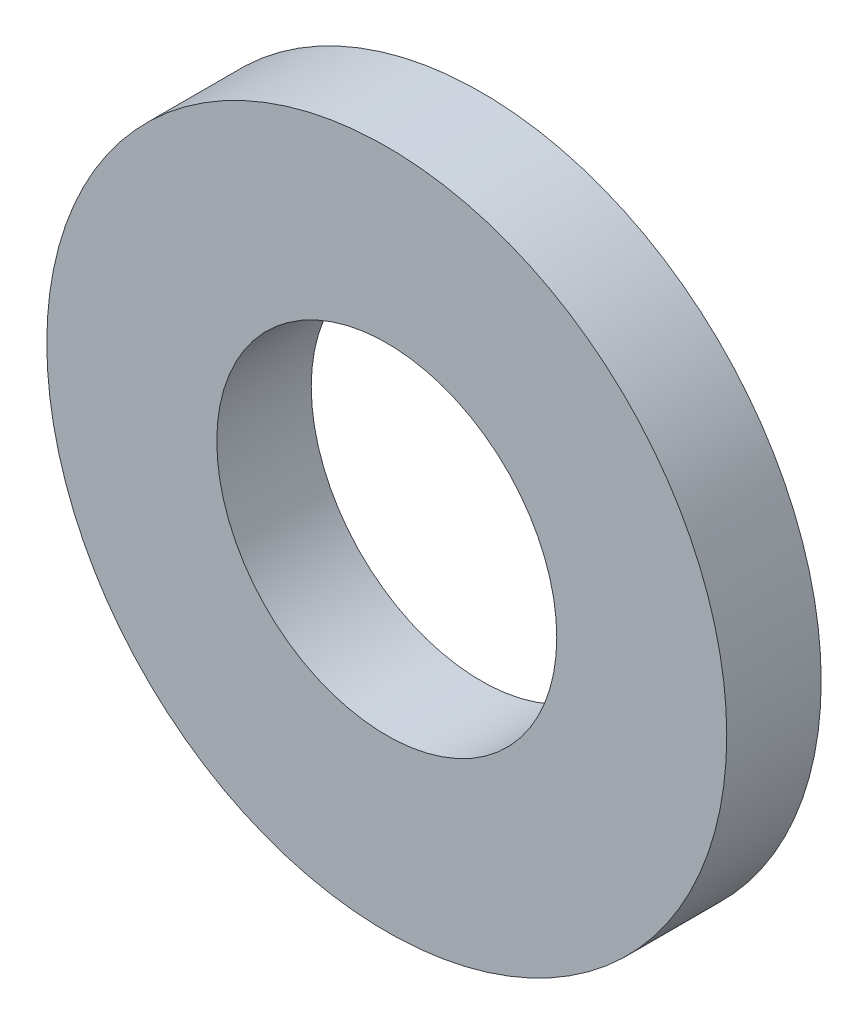
ISO-10303-21;
HEADER;
FILE_DESCRIPTION(('STEP AP214'),'2;1');
FILE_NAME('part.step','',(''),(''),'','','');
FILE_SCHEMA(('AUTOMOTIVE_DESIGN { 1 0 10303 214 1 1 1 1 }'));
ENDSEC;
DATA;
#1=APPLICATION_CONTEXT('core data for automotive mechanical design processes');
#2=APPLICATION_PROTOCOL_DEFINITION('international standard','automotive_design',2000,#1);
#3=PRODUCT_CONTEXT('',#1,'mechanical');
#4=PRODUCT('Part','Part','',(#3));
#5=PRODUCT_RELATED_PRODUCT_CATEGORY('part','',(#4));
#6=PRODUCT_DEFINITION_FORMATION('','',#4);
#7=PRODUCT_DEFINITION_CONTEXT('part definition',#1,'design');
#8=PRODUCT_DEFINITION('design','',#6,#7);
#9=PRODUCT_DEFINITION_SHAPE('','',#8);
#10=(LENGTH_UNIT() NAMED_UNIT(*) SI_UNIT(.MILLI.,.METRE.));
#11=(NAMED_UNIT(*) PLANE_ANGLE_UNIT() SI_UNIT($,.RADIAN.));
#12=(NAMED_UNIT(*) SI_UNIT($,.STERADIAN.) SOLID_ANGLE_UNIT());
#13=UNCERTAINTY_MEASURE_WITH_UNIT(LENGTH_MEASURE(1.E-05),#10,'distance_accuracy_value','');
#14=(GEOMETRIC_REPRESENTATION_CONTEXT(3) GLOBAL_UNCERTAINTY_ASSIGNED_CONTEXT((#13)) GLOBAL_UNIT_ASSIGNED_CONTEXT((#10,
#11,#12)) REPRESENTATION_CONTEXT('',''));
#15=CARTESIAN_POINT('',(0.,0.,0.));
#16=DIRECTION('',(0.,0.,1.));
#17=DIRECTION('',(1.,0.,0.));
#18=AXIS2_PLACEMENT_3D('',#15,#16,#17);
#19=CARTESIAN_POINT('',(0.,0.,1.25));
#20=DIRECTION('',(0.,0.,1.));
#21=DIRECTION('',(1.,0.,0.));
#22=AXIS2_PLACEMENT_3D('',#19,#20,#21);
#23=PLANE('',#22);
#24=CARTESIAN_POINT('',(0.,0.,1.25));
#25=DIRECTION('',(0.,0.,1.));
#26=DIRECTION('',(1.,0.,0.));
#27=AXIS2_PLACEMENT_3D('',#24,#25,#26);
#28=CIRCLE('',#27,9.);
#29=CARTESIAN_POINT('',(9.,0.,1.25));
#30=VERTEX_POINT('',#29);
#31=EDGE_CURVE('E10',#30,#30,#28,.T.);
#32=ORIENTED_EDGE('',*,*,#31,.T.);
#33=EDGE_LOOP('',(#32));
#34=FACE_BOUND('',#33,.T.);
#35=CARTESIAN_POINT('',(0.,0.,1.25));
#36=DIRECTION('',(0.,0.,1.));
#37=DIRECTION('',(1.,0.,0.));
#38=AXIS2_PLACEMENT_3D('',#35,#36,#37);
#39=CIRCLE('',#38,4.5);
#40=CARTESIAN_POINT('',(4.5,0.,1.25));
#41=VERTEX_POINT('',#40);
#42=EDGE_CURVE('E50',#41,#41,#39,.T.);
#43=ORIENTED_EDGE('',*,*,#42,.F.);
#44=EDGE_LOOP('',(#43));
#45=FACE_BOUND('',#44,.T.);
#46=ADVANCED_FACE('F39',(#34,#45),#23,.T.);
#47=CARTESIAN_POINT('',(0.,0.,-1.25));
#48=DIRECTION('',(0.,0.,1.));
#49=DIRECTION('',(1.,0.,0.));
#50=AXIS2_PLACEMENT_3D('',#47,#48,#49);
#51=PLANE('',#50);
#52=CARTESIAN_POINT('',(0.,0.,-1.25));
#53=DIRECTION('',(0.,0.,1.));
#54=DIRECTION('',(1.,0.,0.));
#55=AXIS2_PLACEMENT_3D('',#52,#53,#54);
#56=CIRCLE('',#55,9.);
#57=CARTESIAN_POINT('',(9.,0.,-1.25));
#58=VERTEX_POINT('',#57);
#59=EDGE_CURVE('E43',#58,#58,#56,.T.);
#60=ORIENTED_EDGE('',*,*,#59,.F.);
#61=EDGE_LOOP('',(#60));
#62=FACE_BOUND('',#61,.T.);
#63=CARTESIAN_POINT('',(0.,0.,-1.25));
#64=DIRECTION('',(0.,0.,1.));
#65=DIRECTION('',(1.,0.,0.));
#66=AXIS2_PLACEMENT_3D('',#63,#64,#65);
#67=CIRCLE('',#66,4.5);
#68=CARTESIAN_POINT('',(4.5,0.,-1.25));
#69=VERTEX_POINT('',#68);
#70=EDGE_CURVE('E52',#69,#69,#67,.T.);
#71=ORIENTED_EDGE('',*,*,#70,.T.);
#72=EDGE_LOOP('',(#71));
#73=FACE_BOUND('',#72,.T.);
#74=ADVANCED_FACE('F62',(#62,#73),#51,.F.);
#75=CARTESIAN_POINT('',(0.,0.,1.25));
#76=DIRECTION('',(0.,0.,-1.));
#77=DIRECTION('',(-1.,0.,0.));
#78=AXIS2_PLACEMENT_3D('',#75,#76,#77);
#79=CYLINDRICAL_SURFACE('',#78,9.);
#80=ORIENTED_EDGE('',*,*,#31,.F.);
#81=EDGE_LOOP('',(#80));
#82=FACE_BOUND('',#81,.T.);
#83=ORIENTED_EDGE('',*,*,#59,.T.);
#84=EDGE_LOOP('',(#83));
#85=FACE_BOUND('',#84,.T.);
#86=ADVANCED_FACE('F41',(#82,#85),#79,.T.);
#87=CARTESIAN_POINT('',(0.,0.,1.25));
#88=DIRECTION('',(0.,0.,-1.));
#89=DIRECTION('',(-1.,0.,0.));
#90=AXIS2_PLACEMENT_3D('',#87,#88,#89);
#91=CYLINDRICAL_SURFACE('',#90,4.5);
#92=ORIENTED_EDGE('',*,*,#42,.T.);
#93=EDGE_LOOP('',(#92));
#94=FACE_BOUND('',#93,.T.);
#95=ORIENTED_EDGE('',*,*,#70,.F.);
#96=EDGE_LOOP('',(#95));
#97=FACE_BOUND('',#96,.T.);
#98=ADVANCED_FACE('F58',(#94,#97),#91,.F.);
#99=CLOSED_SHELL('',(#46,#74,#86,#98));
#100=MANIFOLD_SOLID_BREP('B2',#99);
#101=ADVANCED_BREP_SHAPE_REPRESENTATION('',(#18,#100),#14);
#102=SHAPE_DEFINITION_REPRESENTATION(#9,#101);
ENDSEC;
END-ISO-10303-21;
